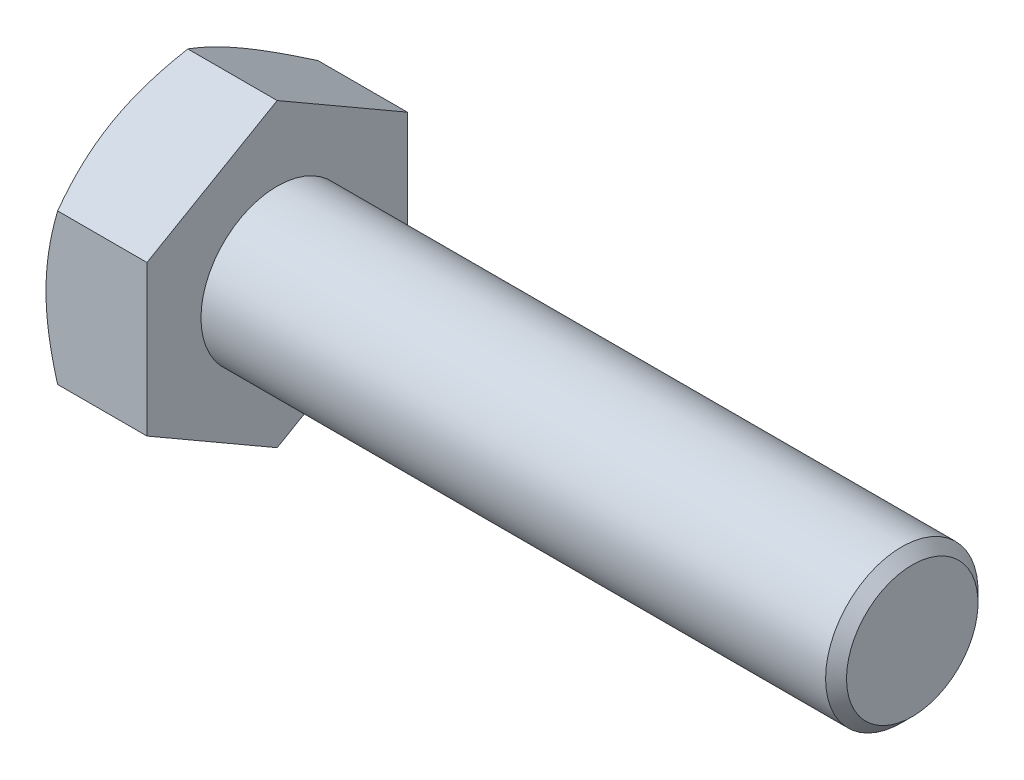
ISO-10303-21;
HEADER;
FILE_DESCRIPTION(('STEP AP214'),'2;1');
FILE_NAME('part.step','',(''),(''),'','','');
FILE_SCHEMA(('AUTOMOTIVE_DESIGN { 1 0 10303 214 1 1 1 1 }'));
ENDSEC;
DATA;
#1=APPLICATION_CONTEXT('core data for automotive mechanical design processes');
#2=APPLICATION_PROTOCOL_DEFINITION('international standard','automotive_design',2000,#1);
#3=PRODUCT_CONTEXT('',#1,'mechanical');
#4=PRODUCT('Part','Part','',(#3));
#5=PRODUCT_RELATED_PRODUCT_CATEGORY('part','',(#4));
#6=PRODUCT_DEFINITION_FORMATION('','',#4);
#7=PRODUCT_DEFINITION_CONTEXT('part definition',#1,'design');
#8=PRODUCT_DEFINITION('design','',#6,#7);
#9=PRODUCT_DEFINITION_SHAPE('','',#8);
#10=(LENGTH_UNIT() NAMED_UNIT(*) SI_UNIT(.MILLI.,.METRE.));
#11=(NAMED_UNIT(*) PLANE_ANGLE_UNIT() SI_UNIT($,.RADIAN.));
#12=(NAMED_UNIT(*) SI_UNIT($,.STERADIAN.) SOLID_ANGLE_UNIT());
#13=UNCERTAINTY_MEASURE_WITH_UNIT(LENGTH_MEASURE(1.E-05),#10,'distance_accuracy_value','');
#14=(GEOMETRIC_REPRESENTATION_CONTEXT(3) GLOBAL_UNCERTAINTY_ASSIGNED_CONTEXT((#13)) GLOBAL_UNIT_ASSIGNED_CONTEXT((#10,
#11,#12)) REPRESENTATION_CONTEXT('',''));
#15=CARTESIAN_POINT('',(0.,0.,0.));
#16=DIRECTION('',(0.,0.,1.));
#17=DIRECTION('',(1.,0.,0.));
#18=AXIS2_PLACEMENT_3D('',#15,#16,#17);
#19=CARTESIAN_POINT('',(15.9,11.8356805183873,-20.5));
#20=DIRECTION('',(0.,-0.866025403784438,0.500000000000001));
#21=DIRECTION('',(0.,-0.500000000000001,-0.866025403784438));
#22=AXIS2_PLACEMENT_3D('',#19,#20,#21);
#23=PLANE('',#22);
#24=CARTESIAN_POINT('',(1.83105281543381,23.6714765068285,0.000200000000000836));
#25=CARTESIAN_POINT('',(1.68086967877726,23.4113332576296,-0.45038132485864));
#26=CARTESIAN_POINT('',(1.53750164097621,23.1501753102484,-0.902720158523128));
#27=CARTESIAN_POINT('',(1.26629011460654,22.6257652404718,-1.81102504337698));
#28=CARTESIAN_POINT('',(1.13845173202013,22.3625124594673,-2.26699223531068));
#29=CARTESIAN_POINT('',(0.900017930659499,21.8334039433281,-3.1834350679811));
#30=CARTESIAN_POINT('',(0.789463310245465,21.5675435780244,-3.64391872840589));
#31=CARTESIAN_POINT('',(0.587971006390334,21.0339755121257,-4.56808572783869));
#32=CARTESIAN_POINT('',(0.497032199485881,20.7662679182344,-5.0317688820304));
#33=CARTESIAN_POINT('',(0.338639409756818,20.2358649520577,-5.95045376793365));
#34=CARTESIAN_POINT('',(0.270661173157543,19.9732089564774,-6.40538729719136));
#35=CARTESIAN_POINT('',(0.156677064296764,19.4466934487165,-7.3173389076062));
#36=CARTESIAN_POINT('',(0.110671614976158,19.1828339134684,-7.77435702871745));
#37=CARTESIAN_POINT('',(0.0417946958369642,18.6546716036599,-8.68916098394869));
#38=CARTESIAN_POINT('',(0.0188957361202562,18.3903697313977,-9.14694525524243));
#39=CARTESIAN_POINT('',(-0.0032757664917089,17.8615220766037,-10.0629362628092));
#40=CARTESIAN_POINT('',(-0.00254903945591723,17.5969763018615,-10.5211429855904));
#41=CARTESIAN_POINT('',(0.0208807818136217,17.1024027845438,-11.3777694456626));
#42=CARTESIAN_POINT('',(0.0407268159283926,16.8723398197347,-11.776250189652));
#43=CARTESIAN_POINT('',(0.0979103594641382,16.412763134205,-12.5722603589635));
#44=CARTESIAN_POINT('',(0.135247618366439,16.1832494056654,-12.9697897978286));
#45=CARTESIAN_POINT('',(0.226766511344944,15.7248559913179,-13.7637504813336));
#46=CARTESIAN_POINT('',(0.280963377501385,15.4959770684536,-14.1601804045161));
#47=CARTESIAN_POINT('',(0.40524228321453,15.0393151399708,-14.9511420665308));
#48=CARTESIAN_POINT('',(0.475324255464135,14.8115321297129,-15.3456738133985));
#49=CARTESIAN_POINT('',(0.711196385255126,14.120031367915,-16.5433882663049));
#50=CARTESIAN_POINT('',(0.900518562282502,13.658278303131,-17.3431680350614));
#51=CARTESIAN_POINT('',(1.22283076676051,12.9707481052865,-18.5340052694661));
#52=CARTESIAN_POINT('',(1.33654034025688,12.7426182858701,-18.9291377074167));
#53=CARTESIAN_POINT('',(1.57547119415012,12.2879365965792,-19.7166694945398));
#54=CARTESIAN_POINT('',(1.70068922992882,12.0613843012077,-20.1090695806946));
#55=CARTESIAN_POINT('',(1.83105281543379,11.8355650483335,-20.5002));
#56=B_SPLINE_CURVE_WITH_KNOTS('',3,(#24,#25,#26,#27,#28,#29,#30,#31,#32,#33,#34,#35,#36,#37,#38,
#39,#40,#41,#42,#43,#44,#45,#46,#47,#48,#49,#50,#51,#52,#53,#54,#55),.UNSPECIFIED.,.F.,.F.,(4,2,
2,2,2,2,2,2,2,2,2,2,2,2,2,4),(0.,1.62462772683814,3.24978817616179,4.87872871091945,
6.50757592600936,8.09621981665213,9.6848942849084,11.2716764634131,12.8584096080289,
14.2397371832637,15.6210449749912,17.0036043735311,18.3861579141107,21.2121645707587,
22.6227063085638,24.0328515805767),.UNSPECIFIED.);
#57=CARTESIAN_POINT('',(1.83098614827934,23.6713610367747,0.));
#58=VERTEX_POINT('',#57);
#59=CARTESIAN_POINT('',(0.,17.753520777581,-10.25));
#60=VERTEX_POINT('',#59);
#61=EDGE_CURVE('E48',#58,#60,#56,.T.);
#62=ORIENTED_EDGE('',*,*,#61,.F.);
#63=DIRECTION('',(-1.,0.,0.));
#64=VECTOR('',#63,1.);
#65=CARTESIAN_POINT('',(15.9,23.6713610367747,0.));
#66=LINE('',#65,#64);
#67=CARTESIAN_POINT('',(15.9,23.6713610367747,0.));
#68=VERTEX_POINT('',#67);
#69=EDGE_CURVE('E144',#68,#58,#66,.T.);
#70=ORIENTED_EDGE('',*,*,#69,.F.);
#71=DIRECTION('',(0.,0.500000000000001,0.866025403784438));
#72=VECTOR('',#71,1.);
#73=CARTESIAN_POINT('',(15.9,11.8356805183873,-20.5));
#74=LINE('',#73,#72);
#75=CARTESIAN_POINT('',(15.9,11.8356805183873,-20.5));
#76=VERTEX_POINT('',#75);
#77=EDGE_CURVE('E229',#76,#68,#74,.T.);
#78=ORIENTED_EDGE('',*,*,#77,.F.);
#79=DIRECTION('',(-1.,0.,0.));
#80=VECTOR('',#79,1.);
#81=CARTESIAN_POINT('',(15.9,11.8356805183873,-20.5));
#82=LINE('',#81,#80);
#83=CARTESIAN_POINT('',(1.83098614827932,11.8356805183873,-20.5));
#84=VERTEX_POINT('',#83);
#85=EDGE_CURVE('E132',#76,#84,#82,.T.);
#86=ORIENTED_EDGE('',*,*,#85,.T.);
#87=EDGE_CURVE('E126',#60,#84,#56,.T.);
#88=ORIENTED_EDGE('',*,*,#87,.F.);
#89=EDGE_LOOP('',(#62,#70,#78,#86,#88));
#90=FACE_BOUND('',#89,.T.);
#91=ADVANCED_FACE('F32',(#90),#23,.F.);
#92=CARTESIAN_POINT('',(15.9,23.6713610367747,0.));
#93=DIRECTION('',(0.,-0.866025403784438,-0.500000000000001));
#94=DIRECTION('',(0.,0.500000000000001,-0.866025403784438));
#95=AXIS2_PLACEMENT_3D('',#92,#93,#94);
#96=PLANE('',#95);
#97=CARTESIAN_POINT('',(1.83105281543379,11.8355650483335,20.5002));
#98=CARTESIAN_POINT('',(1.68086967877724,12.0957082975324,20.0496186751414));
#99=CARTESIAN_POINT('',(1.5375016409762,12.3568662449135,19.5972798414769));
#100=CARTESIAN_POINT('',(1.26629011460653,12.8812763146902,18.688974956623));
#101=CARTESIAN_POINT('',(1.13845173202012,13.1445290956947,18.2330077646893));
#102=CARTESIAN_POINT('',(0.900017930659492,13.6736376118339,17.3165649320189));
#103=CARTESIAN_POINT('',(0.789463310245459,13.9394979771376,16.8560812715941));
#104=CARTESIAN_POINT('',(0.587971006390328,14.4730660430363,15.9319142721613));
#105=CARTESIAN_POINT('',(0.497032199485876,14.7407736369276,15.4682311179696));
#106=CARTESIAN_POINT('',(0.338639409756814,15.2711766031042,14.5495462320663));
#107=CARTESIAN_POINT('',(0.270661173157538,15.5338325986846,14.0946127028086));
#108=CARTESIAN_POINT('',(0.156677064296761,16.0603481064455,13.1826610923938));
#109=CARTESIAN_POINT('',(0.110671614976156,16.3242076416936,12.7256429712826));
#110=CARTESIAN_POINT('',(0.0417946958369632,16.8523699515021,11.8108390160513));
#111=CARTESIAN_POINT('',(0.0188957361202542,17.1166718237643,11.3530547447576));
#112=CARTESIAN_POINT('',(-0.00327576649170896,17.6455194785583,10.4370637371908));
#113=CARTESIAN_POINT('',(-0.00254903945591425,17.9100652533005,9.97885701440962));
#114=CARTESIAN_POINT('',(0.0208807818136257,18.4046387706181,9.1222305543374));
#115=CARTESIAN_POINT('',(0.0407268159283952,18.6347017354273,8.72374981034796));
#116=CARTESIAN_POINT('',(0.0979103594641415,19.094278420957,7.92773964103653));
#117=CARTESIAN_POINT('',(0.135247618366444,19.3237921494965,7.5302102021714));
#118=CARTESIAN_POINT('',(0.22676651134495,19.7821855638441,6.73624951866641));
#119=CARTESIAN_POINT('',(0.280963377501392,20.0110644867084,6.33981959548387));
#120=CARTESIAN_POINT('',(0.405242283214538,20.4677264151912,5.54885793346922));
#121=CARTESIAN_POINT('',(0.475324255464145,20.6955094254491,5.15432618660155));
#122=CARTESIAN_POINT('',(0.711196385255139,21.387010187247,3.95661173369511));
#123=CARTESIAN_POINT('',(0.900518562282514,21.8487632520309,3.15683196493861));
#124=CARTESIAN_POINT('',(1.22283076676052,22.5362934498755,1.96599473053392));
#125=CARTESIAN_POINT('',(1.3365403402569,22.7644232692918,1.57086229258334));
#126=CARTESIAN_POINT('',(1.57547119415014,23.2191049585828,0.783330505460213));
#127=CARTESIAN_POINT('',(1.70068922992884,23.4456572539543,0.390930419305414));
#128=CARTESIAN_POINT('',(1.83105281543381,23.6714765068285,-0.000199999999999681));
#129=B_SPLINE_CURVE_WITH_KNOTS('',3,(#97,#98,#99,#100,#101,#102,#103,#104,#105,#106,#107,#108,
#109,#110,#111,#112,#113,#114,#115,#116,#117,#118,#119,#120,#121,#122,#123,#124,#125,#126,#127,
#128),.UNSPECIFIED.,.F.,.F.,(4,2,2,2,2,2,2,2,2,2,2,2,2,2,2,4),(0.,1.62462772683814,
3.24978817616179,4.87872871091945,6.50757592600936,8.09621981665212,9.68489428490839,
11.2716764634131,12.8584096080289,14.2397371832637,15.6210449749912,17.0036043735311,
18.3861579141107,21.2121645707587,22.6227063085638,24.0328515805767),.UNSPECIFIED.);
#130=CARTESIAN_POINT('',(1.83098614827932,11.8356805183873,20.5));
#131=VERTEX_POINT('',#130);
#132=CARTESIAN_POINT('',(0.,17.753520777581,10.25));
#133=VERTEX_POINT('',#132);
#134=EDGE_CURVE('E55',#131,#133,#129,.T.);
#135=ORIENTED_EDGE('',*,*,#134,.F.);
#136=DIRECTION('',(-1.,0.,0.));
#137=VECTOR('',#136,1.);
#138=CARTESIAN_POINT('',(15.9,11.8356805183873,20.5));
#139=LINE('',#138,#137);
#140=CARTESIAN_POINT('',(15.9,11.8356805183873,20.5));
#141=VERTEX_POINT('',#140);
#142=EDGE_CURVE('E142',#141,#131,#139,.T.);
#143=ORIENTED_EDGE('',*,*,#142,.F.);
#144=DIRECTION('',(0.,-0.500000000000001,0.866025403784438));
#145=VECTOR('',#144,1.);
#146=CARTESIAN_POINT('',(15.9,23.6713610367747,0.));
#147=LINE('',#146,#145);
#148=EDGE_CURVE('E227',#68,#141,#147,.T.);
#149=ORIENTED_EDGE('',*,*,#148,.F.);
#150=ORIENTED_EDGE('',*,*,#69,.T.);
#151=EDGE_CURVE('E159',#133,#58,#129,.T.);
#152=ORIENTED_EDGE('',*,*,#151,.F.);
#153=EDGE_LOOP('',(#135,#143,#149,#150,#152));
#154=FACE_BOUND('',#153,.T.);
#155=ADVANCED_FACE('F165',(#154),#96,.F.);
#156=CARTESIAN_POINT('',(15.9,11.8356805183873,20.5));
#157=DIRECTION('',(0.,0.,-1.));
#158=DIRECTION('',(-1.,0.,0.));
#159=AXIS2_PLACEMENT_3D('',#156,#157,#158);
#160=PLANE('',#159);
#161=CARTESIAN_POINT('',(10.0045735774101,-31.7921389168297,20.5));
#162=CARTESIAN_POINT('',(9.78736329925864,-31.3444790226063,20.5));
#163=CARTESIAN_POINT('',(9.57123614831936,-30.896293830728,20.5));
#164=CARTESIAN_POINT('',(9.14139340339293,-29.9987632315423,20.5));
#165=CARTESIAN_POINT('',(8.92767783367262,-29.5494178126156,20.5));
#166=CARTESIAN_POINT('',(8.29046013485942,-28.1993571494022,20.5));
#167=CARTESIAN_POINT('',(7.87095143624473,-27.2967499011084,20.5));
#168=CARTESIAN_POINT('',(7.04286118778807,-25.480583203283,20.5));
#169=CARTESIAN_POINT('',(6.63435156315197,-24.5669908803155,20.5));
#170=CARTESIAN_POINT('',(5.83404260418421,-22.7325410271718,20.5));
#171=CARTESIAN_POINT('',(5.44224248045819,-21.8116838426448,20.5));
#172=CARTESIAN_POINT('',(4.66751070129249,-19.9314771504444,20.5));
#173=CARTESIAN_POINT('',(4.28526901259515,-18.9718418554754,20.5));
#174=CARTESIAN_POINT('',(3.54971359584654,-17.0413372560874,20.5));
#175=CARTESIAN_POINT('',(3.19640311465207,-16.070466704688,20.5));
#176=CARTESIAN_POINT('',(2.52799067653959,-14.1177960437726,20.5));
#177=CARTESIAN_POINT('',(2.2128113654229,-13.1360226276231,20.5));
#178=CARTESIAN_POINT('',(1.63075735913315,-11.1582993399606,20.5));
#179=CARTESIAN_POINT('',(1.36386744879116,-10.1623540408247,20.5));
#180=CARTESIAN_POINT('',(1.01013936840319,-8.66039751953906,20.5));
#181=CARTESIAN_POINT('',(0.900235340348724,-8.15978559631494,20.5));
#182=CARTESIAN_POINT('',(0.697271023931699,-7.15514108313506,20.5));
#183=CARTESIAN_POINT('',(0.604210388747493,-6.65110856383444,20.5));
#184=CARTESIAN_POINT('',(0.436577049671513,-5.63997954032374,20.5));
#185=CARTESIAN_POINT('',(0.362003751843513,-5.13288313508236,20.5));
#186=CARTESIAN_POINT('',(0.23282804051738,-4.11613536757424,20.5));
#187=CARTESIAN_POINT('',(0.178225615047635,-3.60648400683928,20.5));
#188=CARTESIAN_POINT('',(0.090765733873392,-2.5920207792591,20.5));
#189=CARTESIAN_POINT('',(0.0576332933337335,-2.08723276544726,20.5));
#190=CARTESIAN_POINT('',(0.0127447767670368,-1.07670899405524,20.5));
#191=CARTESIAN_POINT('',(0.000988346370061159,-0.570973252325563,20.5));
#192=CARTESIAN_POINT('',(-0.000868568251924774,0.440543542487558,20.5));
#193=CARTESIAN_POINT('',(0.00903105400039517,0.946324595781566,20.5));
#194=CARTESIAN_POINT('',(0.0502449494820014,1.957018825529,20.5));
#195=CARTESIAN_POINT('',(0.0815601843253854,2.46193196199013,20.5));
#196=CARTESIAN_POINT('',(0.18189293165969,3.67541240372945,20.5));
#197=CARTESIAN_POINT('',(0.261072303371068,4.38315427484418,20.5));
#198=CARTESIAN_POINT('',(0.457195893755735,5.79338947321695,20.5));
#199=CARTESIAN_POINT('',(0.574145248854966,6.49588207331287,20.5));
#200=CARTESIAN_POINT('',(0.841648469050359,7.89494840006496,20.5));
#201=CARTESIAN_POINT('',(0.99222858780067,8.59151705881758,20.5));
#202=CARTESIAN_POINT('',(1.32239799658934,9.97766865129423,20.5));
#203=CARTESIAN_POINT('',(1.50198684412328,10.6672516914077,20.5));
#204=CARTESIAN_POINT('',(1.89003635292229,12.0545545156174,20.5));
#205=CARTESIAN_POINT('',(2.09904485132712,12.7521199961336,20.5));
#206=CARTESIAN_POINT('',(2.538641668,14.1403793411594,20.5));
#207=CARTESIAN_POINT('',(2.76923012728724,14.8310731607321,20.5));
#208=CARTESIAN_POINT('',(3.2483270182559,16.2059303823508,20.5));
#209=CARTESIAN_POINT('',(3.49682946738404,16.8900958789531,20.5));
#210=CARTESIAN_POINT('',(4.00883234587368,18.2527591756487,20.5));
#211=CARTESIAN_POINT('',(4.27233260924537,18.9312570383737,20.5));
#212=CARTESIAN_POINT('',(4.90504075905595,20.5167699200849,20.5));
#213=CARTESIAN_POINT('',(5.27932054344788,21.421757765143,20.5));
#214=CARTESIAN_POINT('',(6.04577825988605,23.224144667096,20.5));
#215=CARTESIAN_POINT('',(6.43795725089847,24.121543271258,20.5));
#216=CARTESIAN_POINT('',(7.23667478358934,25.9101426428634,20.5));
#217=CARTESIAN_POINT('',(7.64321640353473,26.8013420320711,20.5));
#218=CARTESIAN_POINT('',(8.46779917840302,28.5783696709183,20.5));
#219=CARTESIAN_POINT('',(8.88584009832894,29.4641980298681,20.5));
#220=CARTESIAN_POINT('',(9.73174717385664,31.232304730248,20.5));
#221=CARTESIAN_POINT('',(10.1596233349035,32.1145782766106,20.5));
#222=CARTESIAN_POINT('',(11.023106586703,33.8753332789287,20.5));
#223=CARTESIAN_POINT('',(11.458713709275,34.753814719258,20.5));
#224=CARTESIAN_POINT('',(12.336294228428,36.5074549218932,20.5));
#225=CARTESIAN_POINT('',(12.7782668436227,37.3826140756343,20.5));
#226=CARTESIAN_POINT('',(13.6675972041087,39.1301871442554,20.5));
#227=CARTESIAN_POINT('',(14.1149549397484,40.002601064052,20.5));
#228=CARTESIAN_POINT('',(15.3896420293359,42.4725798310685,20.5));
#229=CARTESIAN_POINT('',(16.2223378269472,44.0673751924162,20.5));
#230=CARTESIAN_POINT('',(17.8991647654702,47.250997873102,20.5));
#231=CARTESIAN_POINT('',(18.7432962960686,48.8398249866963,20.5));
#232=CARTESIAN_POINT('',(20.4382614172959,52.0089141659128,20.5));
#233=CARTESIAN_POINT('',(21.2890736349352,53.589187670586,20.5));
#234=CARTESIAN_POINT('',(22.5704014911969,55.9567745219082,20.5));
#235=CARTESIAN_POINT('',(22.9983509772167,56.7454787459173,20.5));
#236=CARTESIAN_POINT('',(23.8557834890834,58.3220516345655,20.5));
#237=CARTESIAN_POINT('',(24.2852665125207,59.1099203005151,20.5));
#238=CARTESIAN_POINT('',(24.7154284836023,59.8974182066807,20.5));
#239=B_SPLINE_CURVE_WITH_KNOTS('',3,(#161,#162,#163,#164,#165,#166,#167,#168,#169,#170,#171,
#172,#173,#174,#175,#176,#177,#178,#179,#180,#181,#182,#183,#184,#185,#186,#187,#188,#189,#190,
#191,#192,#193,#194,#195,#196,#197,#198,#199,#200,#201,#202,#203,#204,#205,#206,#207,#208,#209,
#210,#211,#212,#213,#214,#215,#216,#217,#218,#219,#220,#221,#222,#223,#224,#225,#226,#227,#228,
#229,#230,#231,#232,#233,#234,#235,#236,#237,#238),.UNSPECIFIED.,.F.,.F.,(4,2,2,2,2,2,2,2,2,2,2,
2,2,2,2,2,2,2,2,2,2,2,2,2,2,2,2,2,2,2,2,2,2,2,2,2,2,2,4),(0.,1.49271869282053,2.9854523929492,
5.97136149576122,8.97352680722741,11.9755501321946,15.0740772307499,18.1729515918541,
21.2654301342086,24.3569325858678,25.8942973292462,27.4316304132049,28.9689141013985,
30.5061968680604,32.0233793638815,33.5405367077325,35.0577015110789,36.5749344433597,
38.7102245709997,40.8458052039615,42.9830588287241,45.1202798545095,47.3044767651091,
49.4886879498398,51.6721730451499,53.8556339792163,56.7933660988621,59.7312722486747,
62.6698119306349,65.6082916058346,68.5499059328189,71.4915323697898,74.4328007384971,
77.3740638364239,82.771288514405,88.168697574365,93.5529397785736,96.2449184678808,
98.9368929290924),.UNSPECIFIED.);
#240=CARTESIAN_POINT('',(1.83098614827931,-11.8356805183873,20.5));
#241=VERTEX_POINT('',#240);
#242=CARTESIAN_POINT('',(0.,0.,20.5));
#243=VERTEX_POINT('',#242);
#244=EDGE_CURVE('E239',#241,#243,#239,.T.);
#245=ORIENTED_EDGE('',*,*,#244,.F.);
#246=DIRECTION('',(-1.,0.,0.));
#247=VECTOR('',#246,1.);
#248=CARTESIAN_POINT('',(15.9,-11.8356805183873,20.5));
#249=LINE('',#248,#247);
#250=CARTESIAN_POINT('',(15.9,-11.8356805183873,20.5));
#251=VERTEX_POINT('',#250);
#252=EDGE_CURVE('E134',#251,#241,#249,.T.);
#253=ORIENTED_EDGE('',*,*,#252,.F.);
#254=DIRECTION('',(0.,-1.,0.));
#255=VECTOR('',#254,1.);
#256=CARTESIAN_POINT('',(15.9,11.8356805183873,20.5));
#257=LINE('',#256,#255);
#258=EDGE_CURVE('E223',#141,#251,#257,.T.);
#259=ORIENTED_EDGE('',*,*,#258,.F.);
#260=ORIENTED_EDGE('',*,*,#142,.T.);
#261=EDGE_CURVE('E181',#243,#131,#239,.T.);
#262=ORIENTED_EDGE('',*,*,#261,.F.);
#263=EDGE_LOOP('',(#245,#253,#259,#260,#262));
#264=FACE_BOUND('',#263,.T.);
#265=ADVANCED_FACE('F245',(#264),#160,.F.);
#266=CARTESIAN_POINT('',(15.9,-23.6713610367747,0.));
#267=DIRECTION('',(0.,0.866025403784437,-0.500000000000002));
#268=DIRECTION('',(0.,0.500000000000002,0.866025403784438));
#269=AXIS2_PLACEMENT_3D('',#266,#267,#268);
#270=PLANE('',#269);
#271=CARTESIAN_POINT('',(1.8310528154338,-23.6714765068285,-0.000200000000000067));
#272=CARTESIAN_POINT('',(1.68086967877726,-23.4113332576296,0.450381324858643));
#273=CARTESIAN_POINT('',(1.53750164097621,-23.1501753102484,0.90272015852313));
#274=CARTESIAN_POINT('',(1.26629011460653,-22.6257652404718,1.81102504337698));
#275=CARTESIAN_POINT('',(1.13845173202013,-22.3625124594673,2.26699223531068));
#276=CARTESIAN_POINT('',(0.900017930659495,-21.8334039433281,3.1834350679811));
#277=CARTESIAN_POINT('',(0.789463310245461,-21.5675435780244,3.64391872840589));
#278=CARTESIAN_POINT('',(0.587971006390331,-21.0339755121257,4.56808572783869));
#279=CARTESIAN_POINT('',(0.497032199485879,-20.7662679182344,5.0317688820304));
#280=CARTESIAN_POINT('',(0.338639409756815,-20.2358649520577,5.95045376793365));
#281=CARTESIAN_POINT('',(0.270661173157537,-19.9732089564774,6.40538729719136));
#282=CARTESIAN_POINT('',(0.156677064296757,-19.4466934487165,7.31733890760619));
#283=CARTESIAN_POINT('',(0.110671614976151,-19.1828339134684,7.77435702871745));
#284=CARTESIAN_POINT('',(0.0417946958369568,-18.6546716036599,8.68916098394868));
#285=CARTESIAN_POINT('',(0.0188957361202487,-18.3903697313977,9.14694525524242));
#286=CARTESIAN_POINT('',(-0.00327576649171752,-17.8615220766037,10.0629362628092));
#287=CARTESIAN_POINT('',(-0.00254903945592684,-17.5969763018615,10.5211429855904));
#288=CARTESIAN_POINT('',(0.0208807818136123,-17.1024027845438,11.3777694456626));
#289=CARTESIAN_POINT('',(0.0407268159283841,-16.8723398197346,11.776250189652));
#290=CARTESIAN_POINT('',(0.0979103594641298,-16.412763134205,12.5722603589635));
#291=CARTESIAN_POINT('',(0.135247618366429,-16.1832494056654,12.9697897978286));
#292=CARTESIAN_POINT('',(0.226766511344933,-15.7248559913178,13.7637504813336));
#293=CARTESIAN_POINT('',(0.280963377501373,-15.4959770684536,14.1601804045161));
#294=CARTESIAN_POINT('',(0.405242283214519,-15.0393151399707,14.9511420665308));
#295=CARTESIAN_POINT('',(0.475324255464126,-14.8115321297128,15.3456738133985));
#296=CARTESIAN_POINT('',(0.711196385255119,-14.120031367915,16.5433882663049));
#297=CARTESIAN_POINT('',(0.900518562282493,-13.658278303131,17.3431680350614));
#298=CARTESIAN_POINT('',(1.2228307667605,-12.9707481052864,18.5340052694661));
#299=CARTESIAN_POINT('',(1.33654034025688,-12.7426182858701,18.9291377074167));
#300=CARTESIAN_POINT('',(1.57547119415011,-12.2879365965792,19.7166694945398));
#301=CARTESIAN_POINT('',(1.70068922992881,-12.0613843012077,20.1090695806946));
#302=CARTESIAN_POINT('',(1.83105281543378,-11.8355650483334,20.5002));
#303=B_SPLINE_CURVE_WITH_KNOTS('',3,(#271,#272,#273,#274,#275,#276,#277,#278,#279,#280,#281,
#282,#283,#284,#285,#286,#287,#288,#289,#290,#291,#292,#293,#294,#295,#296,#297,#298,#299,#300,
#301,#302),.UNSPECIFIED.,.F.,.F.,(4,2,2,2,2,2,2,2,2,2,2,2,2,2,2,4),(0.,1.62462772683814,
3.24978817616179,4.87872871091945,6.50757592600936,8.09621981665213,9.6848942849084,
11.2716764634131,12.8584096080289,14.2397371832637,15.6210449749912,17.0036043735311,
18.3861579141107,21.2121645707587,22.6227063085638,24.0328515805767),.UNSPECIFIED.);
#304=CARTESIAN_POINT('',(1.83098614827933,-23.6713610367747,0.));
#305=VERTEX_POINT('',#304);
#306=CARTESIAN_POINT('',(0.,-17.753520777581,10.25));
#307=VERTEX_POINT('',#306);
#308=EDGE_CURVE('E167',#305,#307,#303,.T.);
#309=ORIENTED_EDGE('',*,*,#308,.F.);
#310=DIRECTION('',(-1.,0.,0.));
#311=VECTOR('',#310,1.);
#312=CARTESIAN_POINT('',(15.9,-23.6713610367747,0.));
#313=LINE('',#312,#311);
#314=CARTESIAN_POINT('',(15.9,-23.6713610367747,0.));
#315=VERTEX_POINT('',#314);
#316=EDGE_CURVE('E131',#315,#305,#313,.T.);
#317=ORIENTED_EDGE('',*,*,#316,.F.);
#318=DIRECTION('',(0.,-0.500000000000002,-0.866025403784437));
#319=VECTOR('',#318,1.);
#320=CARTESIAN_POINT('',(15.9,-23.6713610367747,0.));
#321=LINE('',#320,#319);
#322=EDGE_CURVE('E221',#251,#315,#321,.T.);
#323=ORIENTED_EDGE('',*,*,#322,.F.);
#324=ORIENTED_EDGE('',*,*,#252,.T.);
#325=EDGE_CURVE('E169',#307,#241,#303,.T.);
#326=ORIENTED_EDGE('',*,*,#325,.F.);
#327=EDGE_LOOP('',(#309,#317,#323,#324,#326));
#328=FACE_BOUND('',#327,.T.);
#329=ADVANCED_FACE('F217',(#328),#270,.F.);
#330=CARTESIAN_POINT('',(15.9,-11.8356805183873,-20.5));
#331=DIRECTION('',(0.,0.866025403784439,0.5));
#332=DIRECTION('',(0.,-0.5,0.866025403784439));
#333=AXIS2_PLACEMENT_3D('',#330,#331,#332);
#334=PLANE('',#333);
#335=CARTESIAN_POINT('',(1.83105281543381,-11.8355650483335,-20.5002));
#336=CARTESIAN_POINT('',(1.68086967877726,-12.0957082975325,-20.0496186751414));
#337=CARTESIAN_POINT('',(1.53750164097621,-12.3568662449136,-19.5972798414769));
#338=CARTESIAN_POINT('',(1.26629011460654,-12.8812763146902,-18.688974956623));
#339=CARTESIAN_POINT('',(1.13845173202013,-13.1445290956948,-18.2330077646893));
#340=CARTESIAN_POINT('',(0.900017930659504,-13.6736376118339,-17.3165649320189));
#341=CARTESIAN_POINT('',(0.789463310245469,-13.9394979771376,-16.8560812715941));
#342=CARTESIAN_POINT('',(0.587971006390339,-14.4730660430363,-15.9319142721613));
#343=CARTESIAN_POINT('',(0.497032199485888,-14.7407736369276,-15.4682311179696));
#344=CARTESIAN_POINT('',(0.338639409756825,-15.2711766031043,-14.5495462320663));
#345=CARTESIAN_POINT('',(0.270661173157549,-15.5338325986846,-14.0946127028086));
#346=CARTESIAN_POINT('',(0.15667706429677,-16.0603481064455,-13.1826610923938));
#347=CARTESIAN_POINT('',(0.110671614976165,-16.3242076416936,-12.7256429712825));
#348=CARTESIAN_POINT('',(0.0417946958369722,-16.8523699515021,-11.8108390160513));
#349=CARTESIAN_POINT('',(0.0188957361202635,-17.1166718237643,-11.3530547447576));
#350=CARTESIAN_POINT('',(-0.00327576649170025,-17.6455194785583,-10.4370637371908));
#351=CARTESIAN_POINT('',(-0.00254903945590659,-17.9100652533005,-9.97885701440961));
#352=CARTESIAN_POINT('',(0.020880781813634,-18.4046387706182,-9.12223055433739));
#353=CARTESIAN_POINT('',(0.0407268159284048,-18.6347017354273,-8.72374981034795));
#354=CARTESIAN_POINT('',(0.09791035946415,-19.094278420957,-7.92773964103652));
#355=CARTESIAN_POINT('',(0.13524761836645,-19.3237921494966,-7.53021020217139));
#356=CARTESIAN_POINT('',(0.226766511344955,-19.7821855638441,-6.7362495186664));
#357=CARTESIAN_POINT('',(0.280963377501398,-20.0110644867084,-6.33981959548386));
#358=CARTESIAN_POINT('',(0.405242283214544,-20.4677264151912,-5.54885793346921));
#359=CARTESIAN_POINT('',(0.47532425546415,-20.6955094254491,-5.15432618660154));
#360=CARTESIAN_POINT('',(0.711196385255141,-21.387010187247,-3.95661173369511));
#361=CARTESIAN_POINT('',(0.900518562282516,-21.8487632520309,-3.1568319649386));
#362=CARTESIAN_POINT('',(1.22283076676052,-22.5362934498755,-1.96599473053392));
#363=CARTESIAN_POINT('',(1.3365403402569,-22.7644232692918,-1.57086229258334));
#364=CARTESIAN_POINT('',(1.57547119415014,-23.2191049585828,-0.783330505460212));
#365=CARTESIAN_POINT('',(1.70068922992884,-23.4456572539543,-0.390930419305414));
#366=CARTESIAN_POINT('',(1.8310528154338,-23.6714765068285,0.000200000000000271));
#367=B_SPLINE_CURVE_WITH_KNOTS('',3,(#335,#336,#337,#338,#339,#340,#341,#342,#343,#344,#345,
#346,#347,#348,#349,#350,#351,#352,#353,#354,#355,#356,#357,#358,#359,#360,#361,#362,#363,#364,
#365,#366),.UNSPECIFIED.,.F.,.F.,(4,2,2,2,2,2,2,2,2,2,2,2,2,2,2,4),(0.,1.62462772683814,
3.2497881761618,4.87872871091945,6.50757592600936,8.09621981665213,9.6848942849084,
11.2716764634131,12.8584096080289,14.2397371832637,15.6210449749912,17.0036043735311,
18.3861579141107,21.2121645707586,22.6227063085638,24.0328515805766),.UNSPECIFIED.);
#368=CARTESIAN_POINT('',(1.83098614827934,-11.8356805183873,-20.5));
#369=VERTEX_POINT('',#368);
#370=CARTESIAN_POINT('',(0.,-17.753520777581,-10.25));
#371=VERTEX_POINT('',#370);
#372=EDGE_CURVE('E108',#369,#371,#367,.T.);
#373=ORIENTED_EDGE('',*,*,#372,.F.);
#374=DIRECTION('',(-1.,0.,0.));
#375=VECTOR('',#374,1.);
#376=CARTESIAN_POINT('',(15.9,-11.8356805183873,-20.5));
#377=LINE('',#376,#375);
#378=CARTESIAN_POINT('',(15.9,-11.8356805183873,-20.5));
#379=VERTEX_POINT('',#378);
#380=EDGE_CURVE('E122',#379,#369,#377,.T.);
#381=ORIENTED_EDGE('',*,*,#380,.F.);
#382=DIRECTION('',(0.,0.5,-0.866025403784439));
#383=VECTOR('',#382,1.);
#384=CARTESIAN_POINT('',(15.9,-11.8356805183873,-20.5));
#385=LINE('',#384,#383);
#386=EDGE_CURVE('E219',#315,#379,#385,.T.);
#387=ORIENTED_EDGE('',*,*,#386,.F.);
#388=ORIENTED_EDGE('',*,*,#316,.T.);
#389=EDGE_CURVE('E125',#371,#305,#367,.T.);
#390=ORIENTED_EDGE('',*,*,#389,.F.);
#391=EDGE_LOOP('',(#373,#381,#387,#388,#390));
#392=FACE_BOUND('',#391,.T.);
#393=ADVANCED_FACE('F120',(#392),#334,.F.);
#394=CARTESIAN_POINT('',(15.9,11.8356805183873,-20.5));
#395=DIRECTION('',(0.,0.,1.));
#396=DIRECTION('',(0.,-1.,0.));
#397=AXIS2_PLACEMENT_3D('',#394,#395,#396);
#398=PLANE('',#397);
#399=CARTESIAN_POINT('',(10.0045735777148,-31.7921389174576,-20.5));
#400=CARTESIAN_POINT('',(9.78736329955697,-31.3444790232237,-20.5));
#401=CARTESIAN_POINT('',(9.57123614861131,-30.8962938313349,-20.5));
#402=CARTESIAN_POINT('',(9.14139340367214,-29.998763232128,-20.5));
#403=CARTESIAN_POINT('',(8.92767783394548,-29.5494178131908,-20.5));
#404=CARTESIAN_POINT('',(8.29046013511321,-28.1993571499457,-20.5));
#405=CARTESIAN_POINT('',(7.87095143648584,-27.2967499016307,-20.5));
#406=CARTESIAN_POINT('',(7.04286118800381,-25.4805832037627,-20.5));
#407=CARTESIAN_POINT('',(6.63435156335502,-24.5669908807737,-20.5));
#408=CARTESIAN_POINT('',(5.83404260436209,-22.7325410275868,-20.5));
#409=CARTESIAN_POINT('',(5.44224248062359,-21.8116838430381,-20.5));
#410=CARTESIAN_POINT('',(4.66751070143261,-19.9314771507928,-20.5));
#411=CARTESIAN_POINT('',(4.28526901272251,-18.9718418558005,-20.5));
#412=CARTESIAN_POINT('',(3.54971359594906,-17.0413372563656,-20.5));
#413=CARTESIAN_POINT('',(3.19640311474252,-16.0704667049425,-20.5));
#414=CARTESIAN_POINT('',(2.52799067660707,-14.1177960439794,-20.5));
#415=CARTESIAN_POINT('',(2.21281136547947,-13.1360226278058,-20.5));
#416=CARTESIAN_POINT('',(1.63075735916973,-11.1582993400944,-20.5));
#417=CARTESIAN_POINT('',(1.36386744881865,-10.1623540409337,-20.5));
#418=CARTESIAN_POINT('',(1.01013936841766,-8.66039751960431,-20.5));
#419=CARTESIAN_POINT('',(0.900235340358437,-8.15978559636141,-20.5));
#420=CARTESIAN_POINT('',(0.69727102393313,-7.15514108314371,-20.5));
#421=CARTESIAN_POINT('',(0.604210388745403,-6.65110856382404,-20.5));
#422=CARTESIAN_POINT('',(0.436577049663814,-5.63997954027505,-20.5));
#423=CARTESIAN_POINT('',(0.362003751833725,-5.13288313501441,-20.5));
#424=CARTESIAN_POINT('',(0.232828040505,-4.11613536746765,-20.5));
#425=CARTESIAN_POINT('',(0.178225615034752,-3.60648400671328,-20.5));
#426=CARTESIAN_POINT('',(0.090765733861215,-2.5920207790947,-20.5));
#427=CARTESIAN_POINT('',(0.0576332933227346,-2.08723276526385,-20.5));
#428=CARTESIAN_POINT('',(0.0127447767600605,-1.07670899383388,-20.5));
#429=CARTESIAN_POINT('',(0.000988346365929477,-0.570973252085251,-20.5));
#430=CARTESIAN_POINT('',(-0.000868568248742596,0.440543542765633,-20.5));
#431=CARTESIAN_POINT('',(0.00903105400804723,0.94632459607845,-20.5));
#432=CARTESIAN_POINT('',(0.0502449495000926,1.95701882586324,-20.5));
#433=CARTESIAN_POINT('',(0.0815601843494459,2.46193196234294,-20.5));
#434=CARTESIAN_POINT('',(0.181892931698446,3.67541240411128,-20.5));
#435=CARTESIAN_POINT('',(0.261072303418315,4.38315427523641,-20.5));
#436=CARTESIAN_POINT('',(0.45719589382042,5.79338947362951,-20.5));
#437=CARTESIAN_POINT('',(0.574145248928598,6.49588207373536,-20.5));
#438=CARTESIAN_POINT('',(0.84164846914203,7.89494840050697,-20.5));
#439=CARTESIAN_POINT('',(0.992228587901434,8.59151705926917,-20.5));
#440=CARTESIAN_POINT('',(1.32239799670821,9.97766865176471,-20.5));
#441=CARTESIAN_POINT('',(1.50198684425116,10.6672516918875,-20.5));
#442=CARTESIAN_POINT('',(1.89003635306824,12.0545545161161,-20.5));
#443=CARTESIAN_POINT('',(2.09904485148213,12.7521199966418,-20.5));
#444=CARTESIAN_POINT('',(2.53864166817286,14.1403793416866,-20.5));
#445=CARTESIAN_POINT('',(2.76923012746888,14.8310731612688,-20.5));
#446=CARTESIAN_POINT('',(3.24832701845483,16.2059303829063,-20.5));
#447=CARTESIAN_POINT('',(3.49682946759146,16.890095879518,-20.5));
#448=CARTESIAN_POINT('',(4.0088323460978,18.2527591762323,-20.5));
#449=CARTESIAN_POINT('',(4.27233260947769,18.9312570389668,-20.5));
#450=CARTESIAN_POINT('',(4.90504075930104,20.5167699206845,-20.5));
#451=CARTESIAN_POINT('',(5.27932054369704,21.4217577657399,-20.5));
#452=CARTESIAN_POINT('',(6.04577826014241,23.2241446676879,-20.5));
#453=CARTESIAN_POINT('',(6.43795725115796,24.1215432718475,-20.5));
#454=CARTESIAN_POINT('',(7.23667478385437,25.9101426434484,-20.5));
#455=CARTESIAN_POINT('',(7.64321640380215,26.801342032654,-20.5));
#456=CARTESIAN_POINT('',(8.4677991786747,28.5783696714972,-20.5));
#457=CARTESIAN_POINT('',(8.88584009860248,29.4641980304451,-20.5));
#458=CARTESIAN_POINT('',(9.73174717413342,31.2323047308212,-20.5));
#459=CARTESIAN_POINT('',(10.1596233351817,32.1145782771821,-20.5));
#460=CARTESIAN_POINT('',(11.0231065869836,33.8753332794967,-20.5));
#461=CARTESIAN_POINT('',(11.4587137095566,34.7538147198243,-20.5));
#462=CARTESIAN_POINT('',(12.3362942287115,36.5074549224563,-20.5));
#463=CARTESIAN_POINT('',(12.778266843907,37.3826140761959,-20.5));
#464=CARTESIAN_POINT('',(13.6675972043944,39.130187144814,-20.5));
#465=CARTESIAN_POINT('',(14.1149549400347,40.0026010646092,-20.5));
#466=CARTESIAN_POINT('',(15.3896420296247,42.4725798316237,-20.5));
#467=CARTESIAN_POINT('',(16.2223378272376,44.0673751929709,-20.5));
#468=CARTESIAN_POINT('',(17.8991647657637,47.2509978736559,-20.5));
#469=CARTESIAN_POINT('',(18.7432962963634,48.83982498725,-20.5));
#470=CARTESIAN_POINT('',(20.4382614175933,52.0089141664664,-20.5));
#471=CARTESIAN_POINT('',(21.2890736352339,53.5891876711398,-20.5));
#472=CARTESIAN_POINT('',(22.5704014914973,55.9567745224624,-20.5));
#473=CARTESIAN_POINT('',(22.9983509775177,56.7454787464716,-20.5));
#474=CARTESIAN_POINT('',(23.8557834893855,58.3220516351201,-20.5));
#475=CARTESIAN_POINT('',(24.2852665128233,59.1099203010699,-20.5));
#476=CARTESIAN_POINT('',(24.7154284839054,59.8974182072356,-20.5));
#477=B_SPLINE_CURVE_WITH_KNOTS('',3,(#399,#400,#401,#402,#403,#404,#405,#406,#407,#408,#409,
#410,#411,#412,#413,#414,#415,#416,#417,#418,#419,#420,#421,#422,#423,#424,#425,#426,#427,#428,
#429,#430,#431,#432,#433,#434,#435,#436,#437,#438,#439,#440,#441,#442,#443,#444,#445,#446,#447,
#448,#449,#450,#451,#452,#453,#454,#455,#456,#457,#458,#459,#460,#461,#462,#463,#464,#465,#466,
#467,#468,#469,#470,#471,#472,#473,#474,#475,#476),.UNSPECIFIED.,.F.,.F.,(4,2,2,2,2,2,2,2,2,2,2,
2,2,2,2,2,2,2,2,2,2,2,2,2,2,2,2,2,2,2,2,2,2,2,2,2,2,2,4),(0.,1.49271869285733,2.98545239302281,
5.97136149590846,8.97352680744907,11.9755501324907,15.0740772311251,18.1729515923083,
21.2654301347416,24.3569325864795,25.894297329916,27.4316304139328,28.9689141021844,
30.5061968689043,32.0233793647819,33.5405367086895,35.0577015120926,36.57493444443,
38.7102245721038,40.8458052050994,42.9830588298959,45.1202798557152,47.3044767663499,
49.4886879511159,51.6721730464612,53.8556339805627,56.7933661002059,59.7312722500157,
62.6698119319732,65.6082916071701,68.5499059341513,71.4915323711191,74.4328007398234,
77.3740638377472,82.7712885157294,88.1686975756905,93.5529397799015,96.2449184692098,
98.9368929304226),.UNSPECIFIED.);
#478=CARTESIAN_POINT('',(0.,0.,-20.5));
#479=VERTEX_POINT('',#478);
#480=EDGE_CURVE('E114',#84,#479,#477,.F.);
#481=ORIENTED_EDGE('',*,*,#480,.F.);
#482=ORIENTED_EDGE('',*,*,#85,.F.);
#483=DIRECTION('',(0.,1.,0.));
#484=VECTOR('',#483,1.);
#485=CARTESIAN_POINT('',(15.9,11.8356805183873,-20.5));
#486=LINE('',#485,#484);
#487=EDGE_CURVE('E130',#379,#76,#486,.T.);
#488=ORIENTED_EDGE('',*,*,#487,.F.);
#489=ORIENTED_EDGE('',*,*,#380,.T.);
#490=EDGE_CURVE('E105',#479,#369,#477,.F.);
#491=ORIENTED_EDGE('',*,*,#490,.F.);
#492=EDGE_LOOP('',(#481,#482,#488,#489,#491));
#493=FACE_BOUND('',#492,.T.);
#494=ADVANCED_FACE('F128',(#493),#398,.F.);
#495=CARTESIAN_POINT('',(15.9,23.6713610367747,0.));
#496=DIRECTION('',(1.,0.,0.));
#497=DIRECTION('',(0.,0.,-1.));
#498=AXIS2_PLACEMENT_3D('',#495,#496,#497);
#499=PLANE('',#498);
#500=CARTESIAN_POINT('',(15.9,0.,0.));
#501=DIRECTION('',(1.,0.,0.));
#502=DIRECTION('',(0.,0.,-1.));
#503=AXIS2_PLACEMENT_3D('',#500,#501,#502);
#504=CIRCLE('',#503,12.);
#505=CARTESIAN_POINT('',(15.9,0.,-12.));
#506=VERTEX_POINT('',#505);
#507=EDGE_CURVE('E232',#506,#506,#504,.F.);
#508=ORIENTED_EDGE('',*,*,#507,.T.);
#509=EDGE_LOOP('',(#508));
#510=FACE_BOUND('',#509,.T.);
#511=ORIENTED_EDGE('',*,*,#77,.T.);
#512=ORIENTED_EDGE('',*,*,#148,.T.);
#513=ORIENTED_EDGE('',*,*,#258,.T.);
#514=ORIENTED_EDGE('',*,*,#322,.T.);
#515=ORIENTED_EDGE('',*,*,#386,.T.);
#516=ORIENTED_EDGE('',*,*,#487,.T.);
#517=EDGE_LOOP('',(#511,#512,#513,#514,#515,#516));
#518=FACE_BOUND('',#517,.T.);
#519=ADVANCED_FACE('F247',(#510,#518),#499,.T.);
#520=CARTESIAN_POINT('',(0.,0.,0.));
#521=DIRECTION('',(-1.,0.,0.));
#522=DIRECTION('',(0.,0.,1.));
#523=AXIS2_PLACEMENT_3D('',#520,#521,#522);
#524=CYLINDRICAL_SURFACE('',#523,12.);
#525=ORIENTED_EDGE('',*,*,#507,.F.);
#526=EDGE_LOOP('',(#525));
#527=FACE_BOUND('',#526,.T.);
#528=CARTESIAN_POINT('',(114.252,0.,0.));
#529=DIRECTION('',(-1.,0.,0.));
#530=DIRECTION('',(0.,0.,1.));
#531=AXIS2_PLACEMENT_3D('',#528,#529,#530);
#532=CIRCLE('',#531,12.);
#533=CARTESIAN_POINT('',(114.252,0.,12.));
#534=VERTEX_POINT('',#533);
#535=EDGE_CURVE('E235',#534,#534,#532,.T.);
#536=ORIENTED_EDGE('',*,*,#535,.T.);
#537=EDGE_LOOP('',(#536));
#538=FACE_BOUND('',#537,.T.);
#539=ADVANCED_FACE('F278',(#527,#538),#524,.T.);
#540=CARTESIAN_POINT('',(115.9,0.,0.));
#541=DIRECTION('',(-1.,0.,0.));
#542=DIRECTION('',(0.,0.,1.));
#543=AXIS2_PLACEMENT_3D('',#540,#541,#542);
#544=CONICAL_SURFACE('',#543,10.352,0.785398163397449);
#545=ORIENTED_EDGE('',*,*,#535,.F.);
#546=EDGE_LOOP('',(#545));
#547=FACE_BOUND('',#546,.T.);
#548=CARTESIAN_POINT('',(115.9,0.,0.));
#549=DIRECTION('',(-1.,0.,0.));
#550=DIRECTION('',(0.,0.,1.));
#551=AXIS2_PLACEMENT_3D('',#548,#549,#550);
#552=CIRCLE('',#551,10.352);
#553=CARTESIAN_POINT('',(115.9,0.,10.352));
#554=VERTEX_POINT('',#553);
#555=EDGE_CURVE('E237',#554,#554,#552,.T.);
#556=ORIENTED_EDGE('',*,*,#555,.T.);
#557=EDGE_LOOP('',(#556));
#558=FACE_BOUND('',#557,.T.);
#559=ADVANCED_FACE('F281',(#547,#558),#544,.T.);
#560=CARTESIAN_POINT('',(115.9,0.,0.));
#561=DIRECTION('',(-1.,0.,0.));
#562=DIRECTION('',(0.,0.,1.));
#563=AXIS2_PLACEMENT_3D('',#560,#561,#562);
#564=PLANE('',#563);
#565=ORIENTED_EDGE('',*,*,#555,.F.);
#566=EDGE_LOOP('',(#565));
#567=FACE_BOUND('',#566,.T.);
#568=ADVANCED_FACE('F194',(#567),#564,.F.);
#569=CARTESIAN_POINT('',(0.,0.,0.));
#570=DIRECTION('',(1.,0.,0.));
#571=DIRECTION('',(0.,0.,-1.));
#572=AXIS2_PLACEMENT_3D('',#569,#570,#571);
#573=CONICAL_SURFACE('',#572,20.5,1.0471975511966);
#574=ORIENTED_EDGE('',*,*,#372,.T.);
#575=CARTESIAN_POINT('',(0.,0.,0.));
#576=DIRECTION('',(1.,0.,0.));
#577=DIRECTION('',(0.,0.,-1.));
#578=AXIS2_PLACEMENT_3D('',#575,#576,#577);
#579=CIRCLE('',#578,20.5);
#580=EDGE_CURVE('E36',#371,#479,#579,.T.);
#581=ORIENTED_EDGE('',*,*,#580,.T.);
#582=ORIENTED_EDGE('',*,*,#490,.T.);
#583=EDGE_LOOP('',(#574,#581,#582));
#584=FACE_BOUND('',#583,.T.);
#585=ADVANCED_FACE('F107',(#584),#573,.T.);
#586=ORIENTED_EDGE('',*,*,#308,.T.);
#587=EDGE_CURVE('E149',#307,#371,#579,.T.);
#588=ORIENTED_EDGE('',*,*,#587,.T.);
#589=ORIENTED_EDGE('',*,*,#389,.T.);
#590=EDGE_LOOP('',(#586,#588,#589));
#591=FACE_BOUND('',#590,.T.);
#592=ADVANCED_FACE('F193',(#591),#573,.T.);
#593=ORIENTED_EDGE('',*,*,#244,.T.);
#594=EDGE_CURVE('E150',#243,#307,#579,.T.);
#595=ORIENTED_EDGE('',*,*,#594,.T.);
#596=ORIENTED_EDGE('',*,*,#325,.T.);
#597=EDGE_LOOP('',(#593,#595,#596));
#598=FACE_BOUND('',#597,.T.);
#599=ADVANCED_FACE('F188',(#598),#573,.T.);
#600=ORIENTED_EDGE('',*,*,#261,.T.);
#601=ORIENTED_EDGE('',*,*,#134,.T.);
#602=CARTESIAN_POINT('',(0.,0.,0.));
#603=DIRECTION('',(-1.,0.,0.));
#604=DIRECTION('',(0.,0.,1.));
#605=AXIS2_PLACEMENT_3D('',#602,#603,#604);
#606=CIRCLE('',#605,20.5);
#607=EDGE_CURVE('E115',#243,#133,#606,.T.);
#608=ORIENTED_EDGE('',*,*,#607,.F.);
#609=EDGE_LOOP('',(#600,#601,#608));
#610=FACE_BOUND('',#609,.T.);
#611=ADVANCED_FACE('F192',(#610),#573,.T.);
#612=ORIENTED_EDGE('',*,*,#151,.T.);
#613=ORIENTED_EDGE('',*,*,#61,.T.);
#614=EDGE_CURVE('E41',#60,#133,#579,.T.);
#615=ORIENTED_EDGE('',*,*,#614,.T.);
#616=EDGE_LOOP('',(#612,#613,#615));
#617=FACE_BOUND('',#616,.T.);
#618=ADVANCED_FACE('F158',(#617),#573,.T.);
#619=ORIENTED_EDGE('',*,*,#87,.T.);
#620=ORIENTED_EDGE('',*,*,#480,.T.);
#621=EDGE_CURVE('E11',#479,#60,#579,.T.);
#622=ORIENTED_EDGE('',*,*,#621,.T.);
#623=EDGE_LOOP('',(#619,#620,#622));
#624=FACE_BOUND('',#623,.T.);
#625=ADVANCED_FACE('F250',(#624),#573,.T.);
#626=CARTESIAN_POINT('',(0.,23.6713610367747,0.));
#627=DIRECTION('',(1.,0.,0.));
#628=DIRECTION('',(0.,0.,-1.));
#629=AXIS2_PLACEMENT_3D('',#626,#627,#628);
#630=PLANE('',#629);
#631=ORIENTED_EDGE('',*,*,#621,.F.);
#632=ORIENTED_EDGE('',*,*,#580,.F.);
#633=ORIENTED_EDGE('',*,*,#587,.F.);
#634=ORIENTED_EDGE('',*,*,#594,.F.);
#635=ORIENTED_EDGE('',*,*,#607,.T.);
#636=ORIENTED_EDGE('',*,*,#614,.F.);
#637=EDGE_LOOP('',(#631,#632,#633,#634,#635,#636));
#638=FACE_BOUND('',#637,.T.);
#639=ADVANCED_FACE('F162',(#638),#630,.F.);
#640=CLOSED_SHELL('',(#91,#155,#265,#329,#393,#494,#519,#539,#559,#568,#585,#592,#599,#611,#618,
#625,#639));
#641=MANIFOLD_SOLID_BREP('B2',#640);
#642=ADVANCED_BREP_SHAPE_REPRESENTATION('',(#18,#641),#14);
#643=SHAPE_DEFINITION_REPRESENTATION(#9,#642);
ENDSEC;
END-ISO-10303-21;
